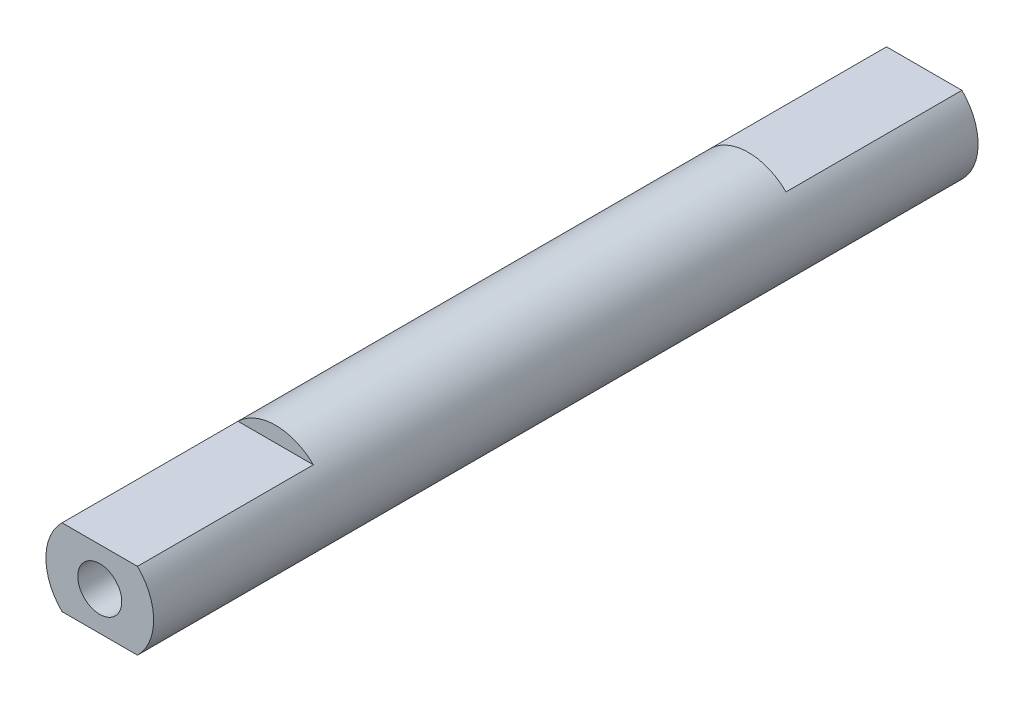
ISO-10303-21;
HEADER;
FILE_DESCRIPTION(('STEP AP214'),'2;1');
FILE_NAME('part.step','',(''),(''),'','','');
FILE_SCHEMA(('AUTOMOTIVE_DESIGN { 1 0 10303 214 1 1 1 1 }'));
ENDSEC;
DATA;
#1=APPLICATION_CONTEXT('core data for automotive mechanical design processes');
#2=APPLICATION_PROTOCOL_DEFINITION('international standard','automotive_design',2000,#1);
#3=PRODUCT_CONTEXT('',#1,'mechanical');
#4=PRODUCT('Part','Part','',(#3));
#5=PRODUCT_RELATED_PRODUCT_CATEGORY('part','',(#4));
#6=PRODUCT_DEFINITION_FORMATION('','',#4);
#7=PRODUCT_DEFINITION_CONTEXT('part definition',#1,'design');
#8=PRODUCT_DEFINITION('design','',#6,#7);
#9=PRODUCT_DEFINITION_SHAPE('','',#8);
#10=(LENGTH_UNIT() NAMED_UNIT(*) SI_UNIT(.MILLI.,.METRE.));
#11=(NAMED_UNIT(*) PLANE_ANGLE_UNIT() SI_UNIT($,.RADIAN.));
#12=(NAMED_UNIT(*) SI_UNIT($,.STERADIAN.) SOLID_ANGLE_UNIT());
#13=UNCERTAINTY_MEASURE_WITH_UNIT(LENGTH_MEASURE(1.E-05),#10,'distance_accuracy_value','');
#14=(GEOMETRIC_REPRESENTATION_CONTEXT(3) GLOBAL_UNCERTAINTY_ASSIGNED_CONTEXT((#13)) GLOBAL_UNIT_ASSIGNED_CONTEXT((#10,
#11,#12)) REPRESENTATION_CONTEXT('',''));
#15=CARTESIAN_POINT('',(0.,0.,0.));
#16=DIRECTION('',(0.,0.,1.));
#17=DIRECTION('',(1.,0.,0.));
#18=AXIS2_PLACEMENT_3D('',#15,#16,#17);
#19=CARTESIAN_POINT('',(0.,0.,-18.75));
#20=DIRECTION('',(0.,0.,1.));
#21=DIRECTION('',(1.,0.,0.));
#22=AXIS2_PLACEMENT_3D('',#19,#20,#21);
#23=CYLINDRICAL_SURFACE('',#22,2.45);
#24=DIRECTION('',(0.,0.,1.));
#25=VECTOR('',#24,1.);
#26=CARTESIAN_POINT('',(1.71464281994823,1.75,10.75));
#27=LINE('',#26,#25);
#28=CARTESIAN_POINT('',(1.71464281994823,1.75,10.75));
#29=VERTEX_POINT('',#28);
#30=CARTESIAN_POINT('',(1.71464281994823,1.75,18.75));
#31=VERTEX_POINT('',#30);
#32=EDGE_CURVE('E153',#29,#31,#27,.T.);
#33=ORIENTED_EDGE('',*,*,#32,.T.);
#34=CARTESIAN_POINT('',(0.,0.,18.75));
#35=DIRECTION('',(0.,0.,1.));
#36=DIRECTION('',(1.,0.,0.));
#37=AXIS2_PLACEMENT_3D('',#34,#35,#36);
#38=CIRCLE('',#37,2.45);
#39=CARTESIAN_POINT('',(1.71464281994823,-1.75,18.75));
#40=VERTEX_POINT('',#39);
#41=EDGE_CURVE('E172',#40,#31,#38,.T.);
#42=ORIENTED_EDGE('',*,*,#41,.F.);
#43=DIRECTION('',(0.,0.,1.));
#44=VECTOR('',#43,1.);
#45=CARTESIAN_POINT('',(1.71464281994823,-1.75,10.75));
#46=LINE('',#45,#44);
#47=CARTESIAN_POINT('',(1.71464281994823,-1.75,10.75));
#48=VERTEX_POINT('',#47);
#49=EDGE_CURVE('E151',#48,#40,#46,.T.);
#50=ORIENTED_EDGE('',*,*,#49,.F.);
#51=CARTESIAN_POINT('',(0.,0.,10.75));
#52=DIRECTION('',(0.,0.,1.));
#53=DIRECTION('',(1.,0.,0.));
#54=AXIS2_PLACEMENT_3D('',#51,#52,#53);
#55=CIRCLE('',#54,2.45);
#56=CARTESIAN_POINT('',(-1.71464281994823,-1.75,10.75));
#57=VERTEX_POINT('',#56);
#58=EDGE_CURVE('E145',#57,#48,#55,.T.);
#59=ORIENTED_EDGE('',*,*,#58,.F.);
#60=DIRECTION('',(0.,0.,1.));
#61=VECTOR('',#60,1.);
#62=CARTESIAN_POINT('',(-1.71464281994823,-1.75,10.75));
#63=LINE('',#62,#61);
#64=CARTESIAN_POINT('',(-1.71464281994823,-1.75,18.75));
#65=VERTEX_POINT('',#64);
#66=EDGE_CURVE('E154',#57,#65,#63,.T.);
#67=ORIENTED_EDGE('',*,*,#66,.T.);
#68=CARTESIAN_POINT('',(-1.71464281994823,1.75,18.75));
#69=VERTEX_POINT('',#68);
#70=EDGE_CURVE('E175',#69,#65,#38,.T.);
#71=ORIENTED_EDGE('',*,*,#70,.F.);
#72=DIRECTION('',(0.,0.,1.));
#73=VECTOR('',#72,1.);
#74=CARTESIAN_POINT('',(-1.71464281994823,1.75,10.75));
#75=LINE('',#74,#73);
#76=CARTESIAN_POINT('',(-1.71464281994823,1.75,10.75));
#77=VERTEX_POINT('',#76);
#78=EDGE_CURVE('E164',#77,#69,#75,.T.);
#79=ORIENTED_EDGE('',*,*,#78,.F.);
#80=CARTESIAN_POINT('',(0.,0.,10.75));
#81=DIRECTION('',(0.,0.,1.));
#82=DIRECTION('',(1.,0.,0.));
#83=AXIS2_PLACEMENT_3D('',#80,#81,#82);
#84=CIRCLE('',#83,2.45);
#85=EDGE_CURVE('E159',#29,#77,#84,.T.);
#86=ORIENTED_EDGE('',*,*,#85,.F.);
#87=EDGE_LOOP('',(#33,#42,#50,#59,#67,#71,#79,#86));
#88=FACE_BOUND('',#87,.T.);
#89=CARTESIAN_POINT('',(0.,0.,-10.75));
#90=DIRECTION('',(0.,0.,1.));
#91=DIRECTION('',(1.,0.,0.));
#92=AXIS2_PLACEMENT_3D('',#89,#90,#91);
#93=CIRCLE('',#92,2.45);
#94=CARTESIAN_POINT('',(1.71464281994823,1.75,-10.75));
#95=VERTEX_POINT('',#94);
#96=CARTESIAN_POINT('',(-1.71464281994823,1.75,-10.75));
#97=VERTEX_POINT('',#96);
#98=EDGE_CURVE('E130',#95,#97,#93,.T.);
#99=ORIENTED_EDGE('',*,*,#98,.T.);
#100=DIRECTION('',(0.,0.,-1.));
#101=VECTOR('',#100,1.);
#102=CARTESIAN_POINT('',(-1.71464281994823,1.75,-10.75));
#103=LINE('',#102,#101);
#104=CARTESIAN_POINT('',(-1.71464281994823,1.75,-18.75));
#105=VERTEX_POINT('',#104);
#106=EDGE_CURVE('E136',#97,#105,#103,.T.);
#107=ORIENTED_EDGE('',*,*,#106,.T.);
#108=CARTESIAN_POINT('',(0.,0.,-18.75));
#109=DIRECTION('',(0.,0.,1.));
#110=DIRECTION('',(1.,0.,0.));
#111=AXIS2_PLACEMENT_3D('',#108,#109,#110);
#112=CIRCLE('',#111,2.45);
#113=CARTESIAN_POINT('',(-1.71464281994823,-1.75,-18.75));
#114=VERTEX_POINT('',#113);
#115=EDGE_CURVE('E11',#105,#114,#112,.T.);
#116=ORIENTED_EDGE('',*,*,#115,.T.);
#117=DIRECTION('',(0.,0.,-1.));
#118=VECTOR('',#117,1.);
#119=CARTESIAN_POINT('',(-1.71464281994823,-1.75,-10.75));
#120=LINE('',#119,#118);
#121=CARTESIAN_POINT('',(-1.71464281994823,-1.75,-10.75));
#122=VERTEX_POINT('',#121);
#123=EDGE_CURVE('E61',#122,#114,#120,.T.);
#124=ORIENTED_EDGE('',*,*,#123,.F.);
#125=CARTESIAN_POINT('',(0.,0.,-10.75));
#126=DIRECTION('',(0.,0.,1.));
#127=DIRECTION('',(1.,0.,0.));
#128=AXIS2_PLACEMENT_3D('',#125,#126,#127);
#129=CIRCLE('',#128,2.45);
#130=CARTESIAN_POINT('',(1.71464281994823,-1.75,-10.75));
#131=VERTEX_POINT('',#130);
#132=EDGE_CURVE('E116',#122,#131,#129,.T.);
#133=ORIENTED_EDGE('',*,*,#132,.T.);
#134=DIRECTION('',(0.,0.,-1.));
#135=VECTOR('',#134,1.);
#136=CARTESIAN_POINT('',(1.71464281994823,-1.75,-10.75));
#137=LINE('',#136,#135);
#138=CARTESIAN_POINT('',(1.71464281994823,-1.75,-18.75));
#139=VERTEX_POINT('',#138);
#140=EDGE_CURVE('E113',#131,#139,#137,.T.);
#141=ORIENTED_EDGE('',*,*,#140,.T.);
#142=CARTESIAN_POINT('',(1.71464281994823,1.75,-18.75));
#143=VERTEX_POINT('',#142);
#144=EDGE_CURVE('E50',#139,#143,#112,.T.);
#145=ORIENTED_EDGE('',*,*,#144,.T.);
#146=DIRECTION('',(0.,0.,-1.));
#147=VECTOR('',#146,1.);
#148=CARTESIAN_POINT('',(1.71464281994823,1.75,-10.75));
#149=LINE('',#148,#147);
#150=EDGE_CURVE('E69',#95,#143,#149,.T.);
#151=ORIENTED_EDGE('',*,*,#150,.F.);
#152=EDGE_LOOP('',(#99,#107,#116,#124,#133,#141,#145,#151));
#153=FACE_BOUND('',#152,.T.);
#154=ADVANCED_FACE('F47',(#88,#153),#23,.T.);
#155=CARTESIAN_POINT('',(0.,0.,-18.75));
#156=DIRECTION('',(0.,0.,1.));
#157=DIRECTION('',(1.,0.,0.));
#158=AXIS2_PLACEMENT_3D('',#155,#156,#157);
#159=PLANE('',#158);
#160=DIRECTION('',(1.,0.,0.));
#161=VECTOR('',#160,1.);
#162=CARTESIAN_POINT('',(-1.71464281994823,1.75,-18.75));
#163=LINE('',#162,#161);
#164=EDGE_CURVE('E133',#105,#143,#163,.T.);
#165=ORIENTED_EDGE('',*,*,#164,.T.);
#166=ORIENTED_EDGE('',*,*,#144,.F.);
#167=DIRECTION('',(-1.,0.,0.));
#168=VECTOR('',#167,1.);
#169=CARTESIAN_POINT('',(-1.71464281994823,-1.75,-18.75));
#170=LINE('',#169,#168);
#171=EDGE_CURVE('E120',#139,#114,#170,.T.);
#172=ORIENTED_EDGE('',*,*,#171,.T.);
#173=ORIENTED_EDGE('',*,*,#115,.F.);
#174=EDGE_LOOP('',(#165,#166,#172,#173));
#175=FACE_BOUND('',#174,.T.);
#176=CARTESIAN_POINT('',(0.,0.,-18.75));
#177=DIRECTION('',(0.,0.,1.));
#178=DIRECTION('',(1.,0.,0.));
#179=AXIS2_PLACEMENT_3D('',#176,#177,#178);
#180=CIRCLE('',#179,1.);
#181=CARTESIAN_POINT('',(1.,0.,-18.75));
#182=VERTEX_POINT('',#181);
#183=EDGE_CURVE('E126',#182,#182,#180,.T.);
#184=ORIENTED_EDGE('',*,*,#183,.T.);
#185=EDGE_LOOP('',(#184));
#186=FACE_BOUND('',#185,.T.);
#187=ADVANCED_FACE('F185',(#175,#186),#159,.F.);
#188=CARTESIAN_POINT('',(0.,0.,18.75));
#189=DIRECTION('',(0.,0.,1.));
#190=DIRECTION('',(1.,0.,0.));
#191=AXIS2_PLACEMENT_3D('',#188,#189,#190);
#192=PLANE('',#191);
#193=DIRECTION('',(1.,0.,0.));
#194=VECTOR('',#193,1.);
#195=CARTESIAN_POINT('',(-1.71464281994823,1.75,18.75));
#196=LINE('',#195,#194);
#197=EDGE_CURVE('E142',#69,#31,#196,.T.);
#198=ORIENTED_EDGE('',*,*,#197,.F.);
#199=ORIENTED_EDGE('',*,*,#70,.T.);
#200=DIRECTION('',(-1.,0.,0.));
#201=VECTOR('',#200,1.);
#202=CARTESIAN_POINT('',(-1.71464281994823,-1.75,18.75));
#203=LINE('',#202,#201);
#204=EDGE_CURVE('E148',#40,#65,#203,.T.);
#205=ORIENTED_EDGE('',*,*,#204,.F.);
#206=ORIENTED_EDGE('',*,*,#41,.T.);
#207=EDGE_LOOP('',(#198,#199,#205,#206));
#208=FACE_BOUND('',#207,.T.);
#209=CARTESIAN_POINT('',(0.,0.,18.75));
#210=DIRECTION('',(0.,0.,1.));
#211=DIRECTION('',(1.,0.,0.));
#212=AXIS2_PLACEMENT_3D('',#209,#210,#211);
#213=CIRCLE('',#212,1.);
#214=CARTESIAN_POINT('',(1.,0.,18.75));
#215=VERTEX_POINT('',#214);
#216=EDGE_CURVE('E157',#215,#215,#213,.T.);
#217=ORIENTED_EDGE('',*,*,#216,.F.);
#218=EDGE_LOOP('',(#217));
#219=FACE_BOUND('',#218,.T.);
#220=ADVANCED_FACE('F205',(#208,#219),#192,.T.);
#221=CARTESIAN_POINT('',(0.,0.,10.75));
#222=DIRECTION('',(0.,0.,1.));
#223=DIRECTION('',(1.,0.,0.));
#224=AXIS2_PLACEMENT_3D('',#221,#222,#223);
#225=CYLINDRICAL_SURFACE('',#224,1.);
#226=CARTESIAN_POINT('',(0.,0.,10.75));
#227=DIRECTION('',(0.,0.,1.));
#228=DIRECTION('',(1.,0.,0.));
#229=AXIS2_PLACEMENT_3D('',#226,#227,#228);
#230=CIRCLE('',#229,1.);
#231=CARTESIAN_POINT('',(1.,0.,10.75));
#232=VERTEX_POINT('',#231);
#233=EDGE_CURVE('E169',#232,#232,#230,.T.);
#234=ORIENTED_EDGE('',*,*,#233,.F.);
#235=EDGE_LOOP('',(#234));
#236=FACE_BOUND('',#235,.T.);
#237=ORIENTED_EDGE('',*,*,#216,.T.);
#238=EDGE_LOOP('',(#237));
#239=FACE_BOUND('',#238,.T.);
#240=ADVANCED_FACE('F232',(#236,#239),#225,.F.);
#241=CARTESIAN_POINT('',(0.,0.,10.75));
#242=DIRECTION('',(0.,0.,1.));
#243=DIRECTION('',(1.,0.,0.));
#244=AXIS2_PLACEMENT_3D('',#241,#242,#243);
#245=PLANE('',#244);
#246=ORIENTED_EDGE('',*,*,#233,.T.);
#247=EDGE_LOOP('',(#246));
#248=FACE_BOUND('',#247,.T.);
#249=ADVANCED_FACE('F229',(#248),#245,.T.);
#250=CARTESIAN_POINT('',(-1.71464281994823,-1.75,10.75));
#251=DIRECTION('',(0.,1.,0.));
#252=DIRECTION('',(0.,0.,1.));
#253=AXIS2_PLACEMENT_3D('',#250,#251,#252);
#254=PLANE('',#253);
#255=ORIENTED_EDGE('',*,*,#204,.T.);
#256=ORIENTED_EDGE('',*,*,#66,.F.);
#257=DIRECTION('',(-1.,0.,0.));
#258=VECTOR('',#257,1.);
#259=CARTESIAN_POINT('',(-1.71464281994823,-1.75,10.75));
#260=LINE('',#259,#258);
#261=EDGE_CURVE('E147',#48,#57,#260,.T.);
#262=ORIENTED_EDGE('',*,*,#261,.F.);
#263=ORIENTED_EDGE('',*,*,#49,.T.);
#264=EDGE_LOOP('',(#255,#256,#262,#263));
#265=FACE_BOUND('',#264,.T.);
#266=ADVANCED_FACE('F226',(#265),#254,.F.);
#267=CARTESIAN_POINT('',(0.,0.,10.75));
#268=DIRECTION('',(0.,0.,1.));
#269=DIRECTION('',(1.,0.,0.));
#270=AXIS2_PLACEMENT_3D('',#267,#268,#269);
#271=PLANE('',#270);
#272=ORIENTED_EDGE('',*,*,#58,.T.);
#273=ORIENTED_EDGE('',*,*,#261,.T.);
#274=EDGE_LOOP('',(#272,#273));
#275=FACE_BOUND('',#274,.T.);
#276=ADVANCED_FACE('F223',(#275),#271,.T.);
#277=CARTESIAN_POINT('',(-1.71464281994823,1.75,10.75));
#278=DIRECTION('',(0.,-1.,0.));
#279=DIRECTION('',(0.,0.,-1.));
#280=AXIS2_PLACEMENT_3D('',#277,#278,#279);
#281=PLANE('',#280);
#282=ORIENTED_EDGE('',*,*,#197,.T.);
#283=ORIENTED_EDGE('',*,*,#32,.F.);
#284=DIRECTION('',(1.,0.,0.));
#285=VECTOR('',#284,1.);
#286=CARTESIAN_POINT('',(-1.71464281994823,1.75,10.75));
#287=LINE('',#286,#285);
#288=EDGE_CURVE('E161',#77,#29,#287,.T.);
#289=ORIENTED_EDGE('',*,*,#288,.F.);
#290=ORIENTED_EDGE('',*,*,#78,.T.);
#291=EDGE_LOOP('',(#282,#283,#289,#290));
#292=FACE_BOUND('',#291,.T.);
#293=ADVANCED_FACE('F211',(#292),#281,.F.);
#294=CARTESIAN_POINT('',(0.,0.,10.75));
#295=DIRECTION('',(0.,0.,1.));
#296=DIRECTION('',(1.,0.,0.));
#297=AXIS2_PLACEMENT_3D('',#294,#295,#296);
#298=PLANE('',#297);
#299=ORIENTED_EDGE('',*,*,#85,.T.);
#300=ORIENTED_EDGE('',*,*,#288,.T.);
#301=EDGE_LOOP('',(#299,#300));
#302=FACE_BOUND('',#301,.T.);
#303=ADVANCED_FACE('F213',(#302),#298,.T.);
#304=CARTESIAN_POINT('',(0.,0.,-10.75));
#305=DIRECTION('',(0.,0.,-1.));
#306=DIRECTION('',(-1.,0.,0.));
#307=AXIS2_PLACEMENT_3D('',#304,#305,#306);
#308=CYLINDRICAL_SURFACE('',#307,1.);
#309=CARTESIAN_POINT('',(0.,0.,-10.75));
#310=DIRECTION('',(0.,0.,1.));
#311=DIRECTION('',(1.,0.,0.));
#312=AXIS2_PLACEMENT_3D('',#309,#310,#311);
#313=CIRCLE('',#312,1.);
#314=CARTESIAN_POINT('',(1.,0.,-10.75));
#315=VERTEX_POINT('',#314);
#316=EDGE_CURVE('E139',#315,#315,#313,.T.);
#317=ORIENTED_EDGE('',*,*,#316,.T.);
#318=EDGE_LOOP('',(#317));
#319=FACE_BOUND('',#318,.T.);
#320=ORIENTED_EDGE('',*,*,#183,.F.);
#321=EDGE_LOOP('',(#320));
#322=FACE_BOUND('',#321,.T.);
#323=ADVANCED_FACE('F214',(#319,#322),#308,.F.);
#324=CARTESIAN_POINT('',(0.,0.,-10.75));
#325=DIRECTION('',(0.,0.,-1.));
#326=DIRECTION('',(1.,0.,0.));
#327=AXIS2_PLACEMENT_3D('',#324,#325,#326);
#328=PLANE('',#327);
#329=ORIENTED_EDGE('',*,*,#316,.F.);
#330=EDGE_LOOP('',(#329));
#331=FACE_BOUND('',#330,.T.);
#332=ADVANCED_FACE('F220',(#331),#328,.T.);
#333=CARTESIAN_POINT('',(-1.71464281994823,-1.75,-10.75));
#334=DIRECTION('',(0.,-1.,0.));
#335=DIRECTION('',(0.,0.,-1.));
#336=AXIS2_PLACEMENT_3D('',#333,#334,#335);
#337=PLANE('',#336);
#338=ORIENTED_EDGE('',*,*,#171,.F.);
#339=ORIENTED_EDGE('',*,*,#140,.F.);
#340=DIRECTION('',(-1.,0.,0.));
#341=VECTOR('',#340,1.);
#342=CARTESIAN_POINT('',(-1.71464281994823,-1.75,-10.75));
#343=LINE('',#342,#341);
#344=EDGE_CURVE('E109',#131,#122,#343,.T.);
#345=ORIENTED_EDGE('',*,*,#344,.T.);
#346=ORIENTED_EDGE('',*,*,#123,.T.);
#347=EDGE_LOOP('',(#338,#339,#345,#346));
#348=FACE_BOUND('',#347,.T.);
#349=ADVANCED_FACE('F111',(#348),#337,.T.);
#350=CARTESIAN_POINT('',(0.,0.,-10.75));
#351=DIRECTION('',(0.,0.,-1.));
#352=DIRECTION('',(1.,0.,0.));
#353=AXIS2_PLACEMENT_3D('',#350,#351,#352);
#354=PLANE('',#353);
#355=ORIENTED_EDGE('',*,*,#132,.F.);
#356=ORIENTED_EDGE('',*,*,#344,.F.);
#357=EDGE_LOOP('',(#355,#356));
#358=FACE_BOUND('',#357,.T.);
#359=ADVANCED_FACE('F118',(#358),#354,.T.);
#360=CARTESIAN_POINT('',(-1.71464281994823,1.75,-10.75));
#361=DIRECTION('',(0.,1.,0.));
#362=DIRECTION('',(0.,0.,1.));
#363=AXIS2_PLACEMENT_3D('',#360,#361,#362);
#364=PLANE('',#363);
#365=ORIENTED_EDGE('',*,*,#164,.F.);
#366=ORIENTED_EDGE('',*,*,#106,.F.);
#367=DIRECTION('',(1.,0.,0.));
#368=VECTOR('',#367,1.);
#369=CARTESIAN_POINT('',(-1.71464281994823,1.75,-10.75));
#370=LINE('',#369,#368);
#371=EDGE_CURVE('E132',#97,#95,#370,.T.);
#372=ORIENTED_EDGE('',*,*,#371,.T.);
#373=ORIENTED_EDGE('',*,*,#150,.T.);
#374=EDGE_LOOP('',(#365,#366,#372,#373));
#375=FACE_BOUND('',#374,.T.);
#376=ADVANCED_FACE('F188',(#375),#364,.T.);
#377=CARTESIAN_POINT('',(0.,0.,-10.75));
#378=DIRECTION('',(0.,0.,-1.));
#379=DIRECTION('',(1.,0.,0.));
#380=AXIS2_PLACEMENT_3D('',#377,#378,#379);
#381=PLANE('',#380);
#382=ORIENTED_EDGE('',*,*,#98,.F.);
#383=ORIENTED_EDGE('',*,*,#371,.F.);
#384=EDGE_LOOP('',(#382,#383));
#385=FACE_BOUND('',#384,.T.);
#386=ADVANCED_FACE('F191',(#385),#381,.T.);
#387=CLOSED_SHELL('',(#154,#187,#220,#240,#249,#266,#276,#293,#303,#323,#332,#349,#359,#376,#386));
#388=MANIFOLD_SOLID_BREP('B2',#387);
#389=ADVANCED_BREP_SHAPE_REPRESENTATION('',(#18,#388),#14);
#390=SHAPE_DEFINITION_REPRESENTATION(#9,#389);
ENDSEC;
END-ISO-10303-21;
